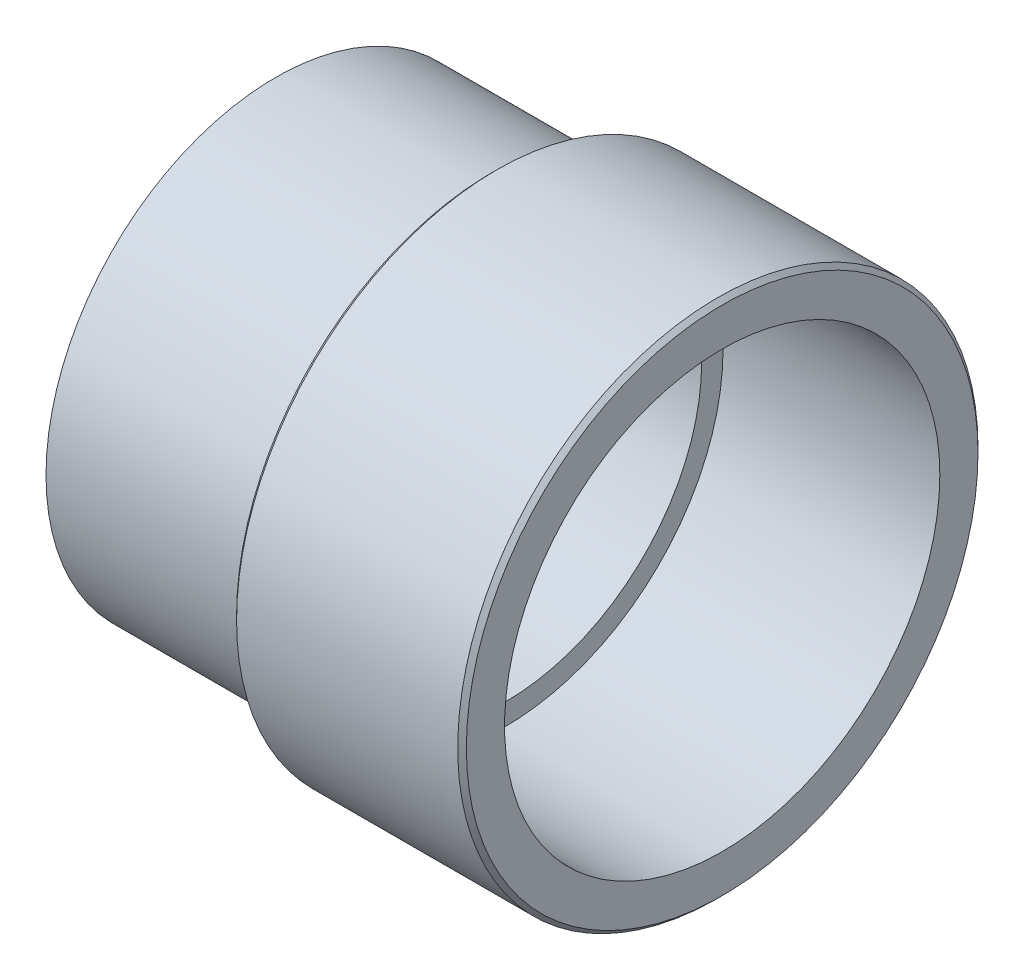
ISO-10303-21;
HEADER;
FILE_DESCRIPTION(('STEP AP214'),'2;1');
FILE_NAME('part.step','',(''),(''),'','','');
FILE_SCHEMA(('AUTOMOTIVE_DESIGN { 1 0 10303 214 1 1 1 1 }'));
ENDSEC;
DATA;
#1=APPLICATION_CONTEXT('core data for automotive mechanical design processes');
#2=APPLICATION_PROTOCOL_DEFINITION('international standard','automotive_design',2000,#1);
#3=PRODUCT_CONTEXT('',#1,'mechanical');
#4=PRODUCT('Part','Part','',(#3));
#5=PRODUCT_RELATED_PRODUCT_CATEGORY('part','',(#4));
#6=PRODUCT_DEFINITION_FORMATION('','',#4);
#7=PRODUCT_DEFINITION_CONTEXT('part definition',#1,'design');
#8=PRODUCT_DEFINITION('design','',#6,#7);
#9=PRODUCT_DEFINITION_SHAPE('','',#8);
#10=(LENGTH_UNIT() NAMED_UNIT(*) SI_UNIT(.MILLI.,.METRE.));
#11=(NAMED_UNIT(*) PLANE_ANGLE_UNIT() SI_UNIT($,.RADIAN.));
#12=(NAMED_UNIT(*) SI_UNIT($,.STERADIAN.) SOLID_ANGLE_UNIT());
#13=UNCERTAINTY_MEASURE_WITH_UNIT(LENGTH_MEASURE(1.E-05),#10,'distance_accuracy_value','');
#14=(GEOMETRIC_REPRESENTATION_CONTEXT(3) GLOBAL_UNCERTAINTY_ASSIGNED_CONTEXT((#13)) GLOBAL_UNIT_ASSIGNED_CONTEXT((#10,
#11,#12)) REPRESENTATION_CONTEXT('',''));
#15=CARTESIAN_POINT('',(0.,0.,0.));
#16=DIRECTION('',(0.,0.,1.));
#17=DIRECTION('',(1.,0.,0.));
#18=AXIS2_PLACEMENT_3D('',#15,#16,#17);
#19=CARTESIAN_POINT('',(13.462,27.305,15.24));
#20=DIRECTION('',(1.,0.,0.));
#21=DIRECTION('',(0.,0.,-1.));
#22=AXIS2_PLACEMENT_3D('',#19,#20,#21);
#23=PLANE('',#22);
#24=CARTESIAN_POINT('',(13.462,15.24,15.24));
#25=DIRECTION('',(1.,0.,0.));
#26=DIRECTION('',(0.,0.,-1.));
#27=AXIS2_PLACEMENT_3D('',#24,#25,#26);
#28=CIRCLE('',#27,12.75);
#29=CARTESIAN_POINT('',(13.462,15.24,2.49));
#30=VERTEX_POINT('',#29);
#31=EDGE_CURVE('E56',#30,#30,#28,.F.);
#32=ORIENTED_EDGE('',*,*,#31,.F.);
#33=EDGE_LOOP('',(#32));
#34=FACE_BOUND('',#33,.T.);
#35=CARTESIAN_POINT('',(13.462,15.24,15.24));
#36=DIRECTION('',(1.,0.,0.));
#37=DIRECTION('',(0.,0.,-1.));
#38=AXIS2_PLACEMENT_3D('',#35,#36,#37);
#39=CIRCLE('',#38,11.5);
#40=CARTESIAN_POINT('',(13.462,15.24,3.74));
#41=VERTEX_POINT('',#40);
#42=EDGE_CURVE('E122',#41,#41,#39,.T.);
#43=ORIENTED_EDGE('',*,*,#42,.F.);
#44=EDGE_LOOP('',(#43));
#45=FACE_BOUND('',#44,.T.);
#46=ADVANCED_FACE('F36',(#34,#45),#23,.T.);
#47=CARTESIAN_POINT('',(26.162,15.24,15.24));
#48=DIRECTION('',(1.,0.,0.));
#49=DIRECTION('',(0.,0.,-1.));
#50=AXIS2_PLACEMENT_3D('',#47,#48,#49);
#51=CYLINDRICAL_SURFACE('',#50,15.24);
#52=CARTESIAN_POINT('',(25.908,15.24,15.24));
#53=DIRECTION('',(1.,0.,0.));
#54=DIRECTION('',(0.,0.,-1.));
#55=AXIS2_PLACEMENT_3D('',#52,#53,#54);
#56=CIRCLE('',#55,15.24);
#57=CARTESIAN_POINT('',(25.908,15.24,0.));
#58=VERTEX_POINT('',#57);
#59=EDGE_CURVE('E76',#58,#58,#56,.F.);
#60=ORIENTED_EDGE('',*,*,#59,.T.);
#61=EDGE_LOOP('',(#60));
#62=FACE_BOUND('',#61,.T.);
#63=CARTESIAN_POINT('',(12.954,15.24,15.24));
#64=DIRECTION('',(-1.,0.,0.));
#65=DIRECTION('',(0.,0.,1.));
#66=AXIS2_PLACEMENT_3D('',#63,#64,#65);
#67=CIRCLE('',#66,15.24);
#68=CARTESIAN_POINT('',(12.954,15.24,30.48));
#69=VERTEX_POINT('',#68);
#70=EDGE_CURVE('E73',#69,#69,#67,.F.);
#71=ORIENTED_EDGE('',*,*,#70,.T.);
#72=EDGE_LOOP('',(#71));
#73=FACE_BOUND('',#72,.T.);
#74=ADVANCED_FACE('F90',(#62,#73),#51,.T.);
#75=CARTESIAN_POINT('',(12.7,30.48,15.24));
#76=DIRECTION('',(-1.,0.,0.));
#77=DIRECTION('',(0.,0.,1.));
#78=AXIS2_PLACEMENT_3D('',#75,#76,#77);
#79=PLANE('',#78);
#80=CARTESIAN_POINT('',(12.7,15.24,15.24));
#81=DIRECTION('',(-1.,0.,0.));
#82=DIRECTION('',(0.,0.,1.));
#83=AXIS2_PLACEMENT_3D('',#80,#81,#82);
#84=CIRCLE('',#83,13.45);
#85=CARTESIAN_POINT('',(12.7,15.24,28.69));
#86=VERTEX_POINT('',#85);
#87=EDGE_CURVE('E48',#86,#86,#84,.T.);
#88=ORIENTED_EDGE('',*,*,#87,.F.);
#89=EDGE_LOOP('',(#88));
#90=FACE_BOUND('',#89,.T.);
#91=CARTESIAN_POINT('',(12.7,15.24,15.24));
#92=DIRECTION('',(-1.,0.,0.));
#93=DIRECTION('',(0.,0.,1.));
#94=AXIS2_PLACEMENT_3D('',#91,#92,#93);
#95=CIRCLE('',#94,14.986);
#96=CARTESIAN_POINT('',(12.7,15.24,30.226));
#97=VERTEX_POINT('',#96);
#98=EDGE_CURVE('E53',#97,#97,#95,.T.);
#99=ORIENTED_EDGE('',*,*,#98,.T.);
#100=EDGE_LOOP('',(#99));
#101=FACE_BOUND('',#100,.T.);
#102=ADVANCED_FACE('F82',(#90,#101),#79,.T.);
#103=CARTESIAN_POINT('',(26.162,15.24,15.24));
#104=DIRECTION('',(-1.,0.,0.));
#105=DIRECTION('',(0.,0.,1.));
#106=AXIS2_PLACEMENT_3D('',#103,#104,#105);
#107=CONICAL_SURFACE('',#106,14.986,0.785398163397435);
#108=ORIENTED_EDGE('',*,*,#59,.F.);
#109=EDGE_LOOP('',(#108));
#110=FACE_BOUND('',#109,.T.);
#111=CARTESIAN_POINT('',(26.162,15.24,15.24));
#112=DIRECTION('',(1.,0.,0.));
#113=DIRECTION('',(0.,0.,-1.));
#114=AXIS2_PLACEMENT_3D('',#111,#112,#113);
#115=CIRCLE('',#114,14.986);
#116=CARTESIAN_POINT('',(26.162,15.24,0.254000000000015));
#117=VERTEX_POINT('',#116);
#118=EDGE_CURVE('E70',#117,#117,#115,.T.);
#119=ORIENTED_EDGE('',*,*,#118,.F.);
#120=EDGE_LOOP('',(#119));
#121=FACE_BOUND('',#120,.T.);
#122=ADVANCED_FACE('F87',(#110,#121),#107,.T.);
#123=CARTESIAN_POINT('',(12.954,15.24,15.24));
#124=DIRECTION('',(1.,0.,0.));
#125=DIRECTION('',(0.,0.,-1.));
#126=AXIS2_PLACEMENT_3D('',#123,#124,#125);
#127=CONICAL_SURFACE('',#126,15.24,0.785398163397465);
#128=ORIENTED_EDGE('',*,*,#98,.F.);
#129=EDGE_LOOP('',(#128));
#130=FACE_BOUND('',#129,.T.);
#131=ORIENTED_EDGE('',*,*,#70,.F.);
#132=EDGE_LOOP('',(#131));
#133=FACE_BOUND('',#132,.T.);
#134=ADVANCED_FACE('F38',(#130,#133),#127,.T.);
#135=CARTESIAN_POINT('',(50.7423448278363,15.24,15.24));
#136=DIRECTION('',(-1.,0.,0.));
#137=DIRECTION('',(0.,0.,1.));
#138=AXIS2_PLACEMENT_3D('',#135,#136,#137);
#139=CYLINDRICAL_SURFACE('',#138,13.45);
#140=ORIENTED_EDGE('',*,*,#87,.T.);
#141=EDGE_LOOP('',(#140));
#142=FACE_BOUND('',#141,.T.);
#143=CARTESIAN_POINT('',(0.,15.24,15.24));
#144=DIRECTION('',(-1.,0.,0.));
#145=DIRECTION('',(0.,0.,1.));
#146=AXIS2_PLACEMENT_3D('',#143,#144,#145);
#147=CIRCLE('',#146,13.45);
#148=CARTESIAN_POINT('',(0.,15.24,28.69));
#149=VERTEX_POINT('',#148);
#150=EDGE_CURVE('E61',#149,#149,#147,.T.);
#151=ORIENTED_EDGE('',*,*,#150,.F.);
#152=EDGE_LOOP('',(#151));
#153=FACE_BOUND('',#152,.T.);
#154=ADVANCED_FACE('F86',(#142,#153),#139,.T.);
#155=CARTESIAN_POINT('',(50.7423448278363,15.24,15.24));
#156=DIRECTION('',(-1.,0.,0.));
#157=DIRECTION('',(0.,0.,1.));
#158=AXIS2_PLACEMENT_3D('',#155,#156,#157);
#159=CYLINDRICAL_SURFACE('',#158,11.5);
#160=CARTESIAN_POINT('',(0.,15.24,15.24));
#161=DIRECTION('',(-1.,0.,0.));
#162=DIRECTION('',(0.,0.,1.));
#163=AXIS2_PLACEMENT_3D('',#160,#161,#162);
#164=CIRCLE('',#163,11.5);
#165=CARTESIAN_POINT('',(0.,15.24,26.74));
#166=VERTEX_POINT('',#165);
#167=EDGE_CURVE('E58',#166,#166,#164,.T.);
#168=ORIENTED_EDGE('',*,*,#167,.T.);
#169=EDGE_LOOP('',(#168));
#170=FACE_BOUND('',#169,.T.);
#171=ORIENTED_EDGE('',*,*,#42,.T.);
#172=EDGE_LOOP('',(#171));
#173=FACE_BOUND('',#172,.T.);
#174=ADVANCED_FACE('F128',(#170,#173),#159,.F.);
#175=CARTESIAN_POINT('',(0.,28.3845,15.24));
#176=DIRECTION('',(-1.,0.,0.));
#177=DIRECTION('',(0.,0.,1.));
#178=AXIS2_PLACEMENT_3D('',#175,#176,#177);
#179=PLANE('',#178);
#180=ORIENTED_EDGE('',*,*,#150,.T.);
#181=EDGE_LOOP('',(#180));
#182=FACE_BOUND('',#181,.T.);
#183=ORIENTED_EDGE('',*,*,#167,.F.);
#184=EDGE_LOOP('',(#183));
#185=FACE_BOUND('',#184,.T.);
#186=ADVANCED_FACE('F108',(#182,#185),#179,.T.);
#187=CARTESIAN_POINT('',(26.162,30.48,15.24));
#188=DIRECTION('',(1.,0.,0.));
#189=DIRECTION('',(0.,0.,-1.));
#190=AXIS2_PLACEMENT_3D('',#187,#188,#189);
#191=PLANE('',#190);
#192=ORIENTED_EDGE('',*,*,#118,.T.);
#193=EDGE_LOOP('',(#192));
#194=FACE_BOUND('',#193,.T.);
#195=CARTESIAN_POINT('',(26.162,15.24,15.24));
#196=DIRECTION('',(1.,0.,0.));
#197=DIRECTION('',(0.,0.,-1.));
#198=AXIS2_PLACEMENT_3D('',#195,#196,#197);
#199=CIRCLE('',#198,12.75);
#200=CARTESIAN_POINT('',(26.162,15.24,2.49));
#201=VERTEX_POINT('',#200);
#202=EDGE_CURVE('E120',#201,#201,#199,.T.);
#203=ORIENTED_EDGE('',*,*,#202,.F.);
#204=EDGE_LOOP('',(#203));
#205=FACE_BOUND('',#204,.T.);
#206=ADVANCED_FACE('F105',(#194,#205),#191,.T.);
#207=CARTESIAN_POINT('',(-24.4346808309118,15.24,15.24));
#208=DIRECTION('',(1.,0.,0.));
#209=DIRECTION('',(0.,0.,-1.));
#210=AXIS2_PLACEMENT_3D('',#207,#208,#209);
#211=CYLINDRICAL_SURFACE('',#210,12.75);
#212=CARTESIAN_POINT('',(13.462,15.24,2.49));
#213=CARTESIAN_POINT('',(13.5942916666667,15.24,2.49));
#214=CARTESIAN_POINT('',(13.7265833333333,15.24,2.49));
#215=CARTESIAN_POINT('',(13.9911666666667,15.24,2.49));
#216=CARTESIAN_POINT('',(14.1234583333333,15.24,2.49));
#217=CARTESIAN_POINT('',(14.3880416666667,15.24,2.49));
#218=CARTESIAN_POINT('',(14.5203333333333,15.24,2.49));
#219=CARTESIAN_POINT('',(14.7849166666667,15.24,2.49));
#220=CARTESIAN_POINT('',(14.9172083333333,15.24,2.49));
#221=CARTESIAN_POINT('',(15.1817916666667,15.24,2.49));
#222=CARTESIAN_POINT('',(15.3140833333333,15.24,2.49));
#223=CARTESIAN_POINT('',(15.5786666666667,15.24,2.49));
#224=CARTESIAN_POINT('',(15.7109583333333,15.24,2.49));
#225=CARTESIAN_POINT('',(15.9755416666667,15.24,2.49));
#226=CARTESIAN_POINT('',(16.1078333333333,15.24,2.49));
#227=CARTESIAN_POINT('',(16.3724166666667,15.24,2.49));
#228=CARTESIAN_POINT('',(16.5047083333333,15.24,2.49));
#229=CARTESIAN_POINT('',(16.7692916666667,15.24,2.49));
#230=CARTESIAN_POINT('',(16.9015833333333,15.24,2.49));
#231=CARTESIAN_POINT('',(17.1661666666667,15.24,2.49));
#232=CARTESIAN_POINT('',(17.2984583333333,15.24,2.49));
#233=CARTESIAN_POINT('',(17.5630416666667,15.24,2.49));
#234=CARTESIAN_POINT('',(17.6953333333333,15.24,2.49));
#235=CARTESIAN_POINT('',(17.9599166666667,15.24,2.49));
#236=CARTESIAN_POINT('',(18.0922083333333,15.24,2.49));
#237=CARTESIAN_POINT('',(18.3567916666667,15.24,2.49));
#238=CARTESIAN_POINT('',(18.4890833333333,15.24,2.49));
#239=CARTESIAN_POINT('',(18.7536666666667,15.24,2.49));
#240=CARTESIAN_POINT('',(18.8859583333333,15.24,2.49));
#241=CARTESIAN_POINT('',(19.1505416666667,15.24,2.49));
#242=CARTESIAN_POINT('',(19.2828333333333,15.24,2.49));
#243=CARTESIAN_POINT('',(19.5474166666667,15.24,2.49));
#244=CARTESIAN_POINT('',(19.6797083333333,15.24,2.49));
#245=CARTESIAN_POINT('',(19.9442916666667,15.24,2.49));
#246=CARTESIAN_POINT('',(20.0765833333333,15.24,2.49));
#247=CARTESIAN_POINT('',(20.3411666666667,15.24,2.49));
#248=CARTESIAN_POINT('',(20.4734583333333,15.24,2.49));
#249=CARTESIAN_POINT('',(20.7380416666667,15.24,2.49));
#250=CARTESIAN_POINT('',(20.8703333333333,15.24,2.49));
#251=CARTESIAN_POINT('',(21.1349166666667,15.24,2.49));
#252=CARTESIAN_POINT('',(21.2672083333333,15.24,2.49));
#253=CARTESIAN_POINT('',(21.5317916666667,15.24,2.49));
#254=CARTESIAN_POINT('',(21.6640833333333,15.24,2.49));
#255=CARTESIAN_POINT('',(21.9286666666667,15.24,2.49));
#256=CARTESIAN_POINT('',(22.0609583333333,15.24,2.49));
#257=CARTESIAN_POINT('',(22.3255416666667,15.24,2.49));
#258=CARTESIAN_POINT('',(22.4578333333333,15.24,2.49));
#259=CARTESIAN_POINT('',(22.7224166666667,15.24,2.49));
#260=CARTESIAN_POINT('',(22.8547083333333,15.24,2.49));
#261=CARTESIAN_POINT('',(23.1192916666667,15.24,2.49));
#262=CARTESIAN_POINT('',(23.2515833333333,15.24,2.49));
#263=CARTESIAN_POINT('',(23.5161666666667,15.24,2.49));
#264=CARTESIAN_POINT('',(23.6484583333333,15.24,2.49));
#265=CARTESIAN_POINT('',(23.9130416666667,15.24,2.49));
#266=CARTESIAN_POINT('',(24.0453333333333,15.24,2.49));
#267=CARTESIAN_POINT('',(24.3099166666667,15.24,2.49));
#268=CARTESIAN_POINT('',(24.4422083333333,15.24,2.49));
#269=CARTESIAN_POINT('',(24.7067916666667,15.24,2.49));
#270=CARTESIAN_POINT('',(24.8390833333333,15.24,2.49));
#271=CARTESIAN_POINT('',(25.1036666666667,15.24,2.49));
#272=CARTESIAN_POINT('',(25.2359583333333,15.24,2.49));
#273=CARTESIAN_POINT('',(25.5005416666667,15.24,2.49));
#274=CARTESIAN_POINT('',(25.6328333333333,15.24,2.49));
#275=CARTESIAN_POINT('',(25.8974166666667,15.24,2.49));
#276=CARTESIAN_POINT('',(26.0297083333333,15.24,2.49));
#277=CARTESIAN_POINT('',(26.162,15.24,2.49));
#278=B_SPLINE_CURVE_WITH_KNOTS('',3,(#212,#213,#214,#215,#216,#217,#218,#219,#220,#221,#222,
#223,#224,#225,#226,#227,#228,#229,#230,#231,#232,#233,#234,#235,#236,#237,#238,#239,#240,#241,
#242,#243,#244,#245,#246,#247,#248,#249,#250,#251,#252,#253,#254,#255,#256,#257,#258,#259,#260,
#261,#262,#263,#264,#265,#266,#267,#268,#269,#270,#271,#272,#273,#274,#275,#276,#277),
.UNSPECIFIED.,.F.,.F.,(4,2,2,2,2,2,2,2,2,2,2,2,2,2,2,2,2,2,2,2,2,2,2,2,2,2,2,2,2,2,2,2,4),(0.,
0.396874999999998,0.793750000000003,1.190625,1.5875,1.984375,2.38125,2.778125,3.175,3.571875,
3.96875,4.365625,4.7625,5.159375,5.55625,5.953125,6.35,6.746875,7.14375,7.540625,7.9375,
8.334375,8.73125,9.128125,9.52500000000001,9.921875,10.31875,10.715625,11.1125,11.509375,
11.90625,12.303125,12.7),.UNSPECIFIED.);
#279=EDGE_CURVE('BSEAM107',#30,#201,#278,.T.);
#280=ORIENTED_EDGE('',*,*,#31,.T.);
#281=ORIENTED_EDGE('',*,*,#202,.T.);
#282=ORIENTED_EDGE('',*,*,#279,.T.);
#283=ORIENTED_EDGE('',*,*,#279,.F.);
#284=EDGE_LOOP('',(#280,#282,#281,#283));
#285=FACE_BOUND('',#284,.T.);
#286=ADVANCED_FACE('F107',(#285),#211,.F.);
#287=CLOSED_SHELL('',(#46,#74,#102,#122,#134,#154,#174,#186,#206,#286));
#288=CARTESIAN_POINT('',(-24.4346808309118,15.24,15.24));
#289=DIRECTION('',(1.,0.,0.));
#290=DIRECTION('',(0.,0.,-1.));
#291=AXIS2_PLACEMENT_3D('',#288,#289,#290);
#292=CYLINDRICAL_SURFACE('',#291,13.3985);
#293=CARTESIAN_POINT('',(14.478,15.24,15.24));
#294=DIRECTION('',(-1.,0.,0.));
#295=DIRECTION('',(0.,0.,1.));
#296=AXIS2_PLACEMENT_3D('',#293,#294,#295);
#297=CIRCLE('',#296,13.3985);
#298=CARTESIAN_POINT('',(14.478,15.24,1.8415));
#299=VERTEX_POINT('',#298);
#300=EDGE_CURVE('E44',#299,#299,#297,.T.);
#301=CARTESIAN_POINT('',(13.462,15.24,15.24));
#302=DIRECTION('',(1.,0.,0.));
#303=DIRECTION('',(0.,0.,-1.));
#304=AXIS2_PLACEMENT_3D('',#301,#302,#303);
#305=CIRCLE('',#304,13.3985);
#306=CARTESIAN_POINT('',(13.462,15.24,1.8415));
#307=VERTEX_POINT('',#306);
#308=EDGE_CURVE('E10',#307,#307,#305,.T.);
#309=CARTESIAN_POINT('',(14.478,15.24,1.8415));
#310=CARTESIAN_POINT('',(14.4674166666667,15.24,1.8415));
#311=CARTESIAN_POINT('',(14.4568333333334,15.24,1.8415));
#312=CARTESIAN_POINT('',(14.4356666666667,15.24,1.8415));
#313=CARTESIAN_POINT('',(14.4250833333334,15.24,1.8415));
#314=CARTESIAN_POINT('',(14.4039166666667,15.24,1.8415));
#315=CARTESIAN_POINT('',(14.3933333333334,15.24,1.8415));
#316=CARTESIAN_POINT('',(14.3721666666667,15.24,1.8415));
#317=CARTESIAN_POINT('',(14.3615833333334,15.24,1.8415));
#318=CARTESIAN_POINT('',(14.3404166666667,15.24,1.8415));
#319=CARTESIAN_POINT('',(14.3298333333334,15.24,1.8415));
#320=CARTESIAN_POINT('',(14.3086666666667,15.24,1.8415));
#321=CARTESIAN_POINT('',(14.2980833333334,15.24,1.8415));
#322=CARTESIAN_POINT('',(14.2769166666667,15.24,1.8415));
#323=CARTESIAN_POINT('',(14.2663333333333,15.24,1.8415));
#324=CARTESIAN_POINT('',(14.2451666666667,15.24,1.8415));
#325=CARTESIAN_POINT('',(14.2345833333334,15.24,1.8415));
#326=CARTESIAN_POINT('',(14.2134166666667,15.24,1.8415));
#327=CARTESIAN_POINT('',(14.2028333333334,15.24,1.8415));
#328=CARTESIAN_POINT('',(14.1816666666667,15.24,1.8415));
#329=CARTESIAN_POINT('',(14.1710833333334,15.24,1.8415));
#330=CARTESIAN_POINT('',(14.1499166666667,15.24,1.8415));
#331=CARTESIAN_POINT('',(14.1393333333333,15.24,1.8415));
#332=CARTESIAN_POINT('',(14.1181666666667,15.24,1.8415));
#333=CARTESIAN_POINT('',(14.1075833333333,15.24,1.8415));
#334=CARTESIAN_POINT('',(14.0864166666667,15.24,1.8415));
#335=CARTESIAN_POINT('',(14.0758333333334,15.24,1.8415));
#336=CARTESIAN_POINT('',(14.0546666666667,15.24,1.8415));
#337=CARTESIAN_POINT('',(14.0440833333333,15.24,1.8415));
#338=CARTESIAN_POINT('',(14.0229166666667,15.24,1.8415));
#339=CARTESIAN_POINT('',(14.0123333333333,15.24,1.8415));
#340=CARTESIAN_POINT('',(13.9911666666667,15.24,1.8415));
#341=CARTESIAN_POINT('',(13.9805833333333,15.24,1.8415));
#342=CARTESIAN_POINT('',(13.9594166666667,15.24,1.8415));
#343=CARTESIAN_POINT('',(13.9488333333333,15.24,1.8415));
#344=CARTESIAN_POINT('',(13.9276666666667,15.24,1.8415));
#345=CARTESIAN_POINT('',(13.9170833333333,15.24,1.8415));
#346=CARTESIAN_POINT('',(13.8959166666667,15.24,1.8415));
#347=CARTESIAN_POINT('',(13.8853333333333,15.24,1.8415));
#348=CARTESIAN_POINT('',(13.8641666666667,15.24,1.8415));
#349=CARTESIAN_POINT('',(13.8535833333333,15.24,1.8415));
#350=CARTESIAN_POINT('',(13.8324166666667,15.24,1.8415));
#351=CARTESIAN_POINT('',(13.8218333333333,15.24,1.8415));
#352=CARTESIAN_POINT('',(13.8006666666667,15.24,1.8415));
#353=CARTESIAN_POINT('',(13.7900833333333,15.24,1.8415));
#354=CARTESIAN_POINT('',(13.7689166666667,15.24,1.8415));
#355=CARTESIAN_POINT('',(13.7583333333333,15.24,1.8415));
#356=CARTESIAN_POINT('',(13.7371666666667,15.24,1.8415));
#357=CARTESIAN_POINT('',(13.7265833333333,15.24,1.8415));
#358=CARTESIAN_POINT('',(13.7054166666667,15.24,1.8415));
#359=CARTESIAN_POINT('',(13.6948333333333,15.24,1.8415));
#360=CARTESIAN_POINT('',(13.6736666666667,15.24,1.8415));
#361=CARTESIAN_POINT('',(13.6630833333333,15.24,1.8415));
#362=CARTESIAN_POINT('',(13.6419166666667,15.24,1.8415));
#363=CARTESIAN_POINT('',(13.6313333333333,15.24,1.8415));
#364=CARTESIAN_POINT('',(13.6101666666667,15.24,1.8415));
#365=CARTESIAN_POINT('',(13.5995833333333,15.24,1.8415));
#366=CARTESIAN_POINT('',(13.5784166666667,15.24,1.8415));
#367=CARTESIAN_POINT('',(13.5678333333333,15.24,1.8415));
#368=CARTESIAN_POINT('',(13.5466666666667,15.24,1.8415));
#369=CARTESIAN_POINT('',(13.5360833333333,15.24,1.8415));
#370=CARTESIAN_POINT('',(13.5149166666667,15.24,1.8415));
#371=CARTESIAN_POINT('',(13.5043333333333,15.24,1.8415));
#372=CARTESIAN_POINT('',(13.4831666666667,15.24,1.8415));
#373=CARTESIAN_POINT('',(13.4725833333333,15.24,1.8415));
#374=CARTESIAN_POINT('',(13.462,15.24,1.8415));
#375=B_SPLINE_CURVE_WITH_KNOTS('',3,(#309,#310,#311,#312,#313,#314,#315,#316,#317,#318,#319,
#320,#321,#322,#323,#324,#325,#326,#327,#328,#329,#330,#331,#332,#333,#334,#335,#336,#337,#338,
#339,#340,#341,#342,#343,#344,#345,#346,#347,#348,#349,#350,#351,#352,#353,#354,#355,#356,#357,
#358,#359,#360,#361,#362,#363,#364,#365,#366,#367,#368,#369,#370,#371,#372,#373,#374),
.UNSPECIFIED.,.F.,.F.,(4,2,2,2,2,2,2,2,2,2,2,2,2,2,2,2,2,2,2,2,2,2,2,2,2,2,2,2,2,2,2,2,4),(0.,
0.0317499999999971,0.0635000000000011,0.0952500000000051,0.127000000000002,0.158749999999999,
0.190500000000003,0.222250000000007,0.254000000000004,0.285750000000001,0.317500000000005,
0.349250000000009,0.381000000000006,0.412750000000003,0.444500000000007,0.476250000000011,
0.508000000000008,0.539750000000006,0.571500000000009,0.603250000000013,0.635000000000011,
0.666750000000008,0.698500000000012,0.730250000000016,0.762000000000013,0.79375000000001,
0.825500000000014,0.857250000000018,0.889000000000015,0.920750000000012,0.952500000000016,
0.98425000000002,1.01600000000002),.UNSPECIFIED.);
#376=EDGE_CURVE('BSEAM141',#299,#307,#375,.T.);
#377=ORIENTED_EDGE('',*,*,#300,.T.);
#378=ORIENTED_EDGE('',*,*,#308,.T.);
#379=ORIENTED_EDGE('',*,*,#376,.T.);
#380=ORIENTED_EDGE('',*,*,#376,.F.);
#381=EDGE_LOOP('',(#377,#379,#378,#380));
#382=FACE_BOUND('',#381,.T.);
#383=ADVANCED_FACE('F141',(#382),#292,.T.);
#384=ORIENTED_EDGE('',*,*,#308,.F.);
#385=EDGE_LOOP('',(#384));
#386=FACE_BOUND('',#385,.T.);
#387=CARTESIAN_POINT('',(13.462,15.24,15.24));
#388=DIRECTION('',(1.,0.,0.));
#389=DIRECTION('',(0.,0.,-1.));
#390=AXIS2_PLACEMENT_3D('',#387,#388,#389);
#391=CIRCLE('',#390,13.843);
#392=CARTESIAN_POINT('',(13.462,15.24,1.397));
#393=VERTEX_POINT('',#392);
#394=EDGE_CURVE('E67',#393,#393,#391,.T.);
#395=ORIENTED_EDGE('',*,*,#394,.T.);
#396=EDGE_LOOP('',(#395));
#397=FACE_BOUND('',#396,.T.);
#398=ADVANCED_FACE('F102',(#386,#397),#23,.T.);
#399=CARTESIAN_POINT('',(26.162,15.24,15.24));
#400=DIRECTION('',(1.,0.,0.));
#401=DIRECTION('',(0.,0.,-1.));
#402=AXIS2_PLACEMENT_3D('',#399,#400,#401);
#403=CYLINDRICAL_SURFACE('',#402,13.843);
#404=CARTESIAN_POINT('',(14.478,15.24,15.24));
#405=DIRECTION('',(1.,0.,0.));
#406=DIRECTION('',(0.,0.,-1.));
#407=AXIS2_PLACEMENT_3D('',#404,#405,#406);
#408=CIRCLE('',#407,13.843);
#409=CARTESIAN_POINT('',(14.478,15.24,1.397));
#410=VERTEX_POINT('',#409);
#411=EDGE_CURVE('E64',#410,#410,#408,.T.);
#412=ORIENTED_EDGE('',*,*,#411,.T.);
#413=EDGE_LOOP('',(#412));
#414=FACE_BOUND('',#413,.T.);
#415=ORIENTED_EDGE('',*,*,#394,.F.);
#416=EDGE_LOOP('',(#415));
#417=FACE_BOUND('',#416,.T.);
#418=ADVANCED_FACE('F147',(#414,#417),#403,.F.);
#419=CARTESIAN_POINT('',(14.478,29.083,15.24));
#420=DIRECTION('',(-1.,0.,0.));
#421=DIRECTION('',(0.,0.,1.));
#422=AXIS2_PLACEMENT_3D('',#419,#420,#421);
#423=PLANE('',#422);
#424=ORIENTED_EDGE('',*,*,#300,.F.);
#425=EDGE_LOOP('',(#424));
#426=FACE_BOUND('',#425,.T.);
#427=ORIENTED_EDGE('',*,*,#411,.F.);
#428=EDGE_LOOP('',(#427));
#429=FACE_BOUND('',#428,.T.);
#430=ADVANCED_FACE('F144',(#426,#429),#423,.T.);
#431=CLOSED_SHELL('',(#383,#398,#418,#430));
#432=ORIENTED_CLOSED_SHELL('',*,#431,.T.);
#433=BREP_WITH_VOIDS('B2',#287,(#432));
#434=ADVANCED_BREP_SHAPE_REPRESENTATION('',(#18,#433),#14);
#435=SHAPE_DEFINITION_REPRESENTATION(#9,#434);
ENDSEC;
END-ISO-10303-21;
